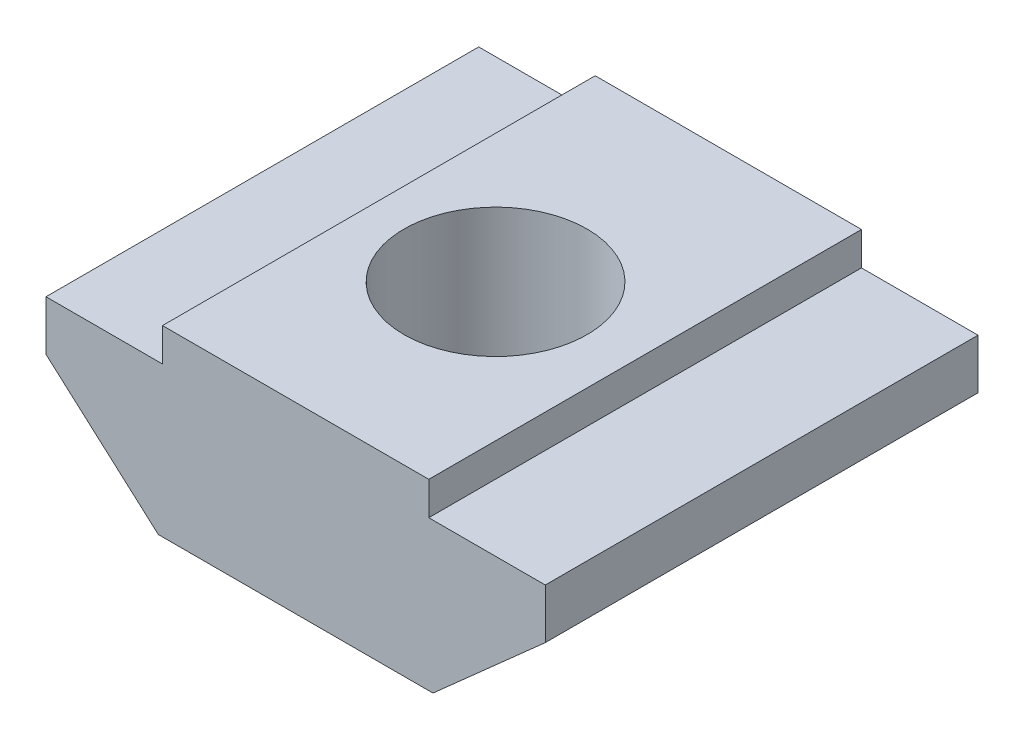
ISO-10303-21;
HEADER;
FILE_DESCRIPTION(('STEP AP214'),'2;1');
FILE_NAME('part.step','',(''),(''),'','','');
FILE_SCHEMA(('AUTOMOTIVE_DESIGN { 1 0 10303 214 1 1 1 1 }'));
ENDSEC;
DATA;
#1=APPLICATION_CONTEXT('core data for automotive mechanical design processes');
#2=APPLICATION_PROTOCOL_DEFINITION('international standard','automotive_design',2000,#1);
#3=PRODUCT_CONTEXT('',#1,'mechanical');
#4=PRODUCT('Part','Part','',(#3));
#5=PRODUCT_RELATED_PRODUCT_CATEGORY('part','',(#4));
#6=PRODUCT_DEFINITION_FORMATION('','',#4);
#7=PRODUCT_DEFINITION_CONTEXT('part definition',#1,'design');
#8=PRODUCT_DEFINITION('design','',#6,#7);
#9=PRODUCT_DEFINITION_SHAPE('','',#8);
#10=(LENGTH_UNIT() NAMED_UNIT(*) SI_UNIT(.MILLI.,.METRE.));
#11=(NAMED_UNIT(*) PLANE_ANGLE_UNIT() SI_UNIT($,.RADIAN.));
#12=(NAMED_UNIT(*) SI_UNIT($,.STERADIAN.) SOLID_ANGLE_UNIT());
#13=UNCERTAINTY_MEASURE_WITH_UNIT(LENGTH_MEASURE(1.E-05),#10,'distance_accuracy_value','');
#14=(GEOMETRIC_REPRESENTATION_CONTEXT(3) GLOBAL_UNCERTAINTY_ASSIGNED_CONTEXT((#13)) GLOBAL_UNIT_ASSIGNED_CONTEXT((#10,
#11,#12)) REPRESENTATION_CONTEXT('',''));
#15=CARTESIAN_POINT('',(0.,0.,0.));
#16=DIRECTION('',(0.,0.,1.));
#17=DIRECTION('',(1.,0.,0.));
#18=AXIS2_PLACEMENT_3D('',#15,#16,#17);
#19=CARTESIAN_POINT('',(-4.33688549496153,5.5,13.));
#20=DIRECTION('',(0.,-1.,0.));
#21=DIRECTION('',(0.,0.,-1.));
#22=AXIS2_PLACEMENT_3D('',#19,#20,#21);
#23=PLANE('',#22);
#24=DIRECTION('',(-1.,0.,0.));
#25=VECTOR('',#24,1.);
#26=CARTESIAN_POINT('',(-4.33688549496153,5.5,0.));
#27=LINE('',#26,#25);
#28=CARTESIAN_POINT('',(3.66311450503847,5.5,0.));
#29=VERTEX_POINT('',#28);
#30=CARTESIAN_POINT('',(-4.33688549496153,5.5,0.));
#31=VERTEX_POINT('',#30);
#32=EDGE_CURVE('E157',#29,#31,#27,.T.);
#33=ORIENTED_EDGE('',*,*,#32,.T.);
#34=DIRECTION('',(0.,0.,-1.));
#35=VECTOR('',#34,1.);
#36=CARTESIAN_POINT('',(-4.33688549496153,5.5,13.));
#37=LINE('',#36,#35);
#38=CARTESIAN_POINT('',(-4.33688549496153,5.5,13.));
#39=VERTEX_POINT('',#38);
#40=EDGE_CURVE('E134',#39,#31,#37,.T.);
#41=ORIENTED_EDGE('',*,*,#40,.F.);
#42=DIRECTION('',(-1.,0.,0.));
#43=VECTOR('',#42,1.);
#44=CARTESIAN_POINT('',(-4.33688549496153,5.5,13.));
#45=LINE('',#44,#43);
#46=CARTESIAN_POINT('',(3.66311450503847,5.5,13.));
#47=VERTEX_POINT('',#46);
#48=EDGE_CURVE('E125',#47,#39,#45,.T.);
#49=ORIENTED_EDGE('',*,*,#48,.F.);
#50=DIRECTION('',(0.,0.,-1.));
#51=VECTOR('',#50,1.);
#52=CARTESIAN_POINT('',(3.66311450503847,5.5,13.));
#53=LINE('',#52,#51);
#54=EDGE_CURVE('E166',#47,#29,#53,.T.);
#55=ORIENTED_EDGE('',*,*,#54,.T.);
#56=EDGE_LOOP('',(#33,#41,#49,#55));
#57=FACE_BOUND('',#56,.T.);
#58=CARTESIAN_POINT('',(-0.471799647864915,5.5,6.85919347099833));
#59=DIRECTION('',(0.,1.,0.));
#60=DIRECTION('',(0.,0.,1.));
#61=AXIS2_PLACEMENT_3D('',#58,#59,#60);
#62=CIRCLE('',#61,2.75);
#63=CARTESIAN_POINT('',(-0.471799647864915,5.5,9.60919347099833));
#64=VERTEX_POINT('',#63);
#65=EDGE_CURVE('E211',#64,#64,#62,.T.);
#66=ORIENTED_EDGE('',*,*,#65,.F.);
#67=EDGE_LOOP('',(#66));
#68=FACE_BOUND('',#67,.T.);
#69=ADVANCED_FACE('F34',(#57,#68),#23,.F.);
#70=CARTESIAN_POINT('',(-4.46188549496153,0.,13.));
#71=DIRECTION('',(0.66436383882992,0.74740931868366,0.));
#72=DIRECTION('',(-0.74740931868366,0.66436383882992,0.));
#73=AXIS2_PLACEMENT_3D('',#70,#71,#72);
#74=PLANE('',#73);
#75=DIRECTION('',(0.74740931868366,-0.66436383882992,0.));
#76=VECTOR('',#75,1.);
#77=CARTESIAN_POINT('',(-4.46188549496153,0.,0.));
#78=LINE('',#77,#76);
#79=CARTESIAN_POINT('',(-7.83688549496153,3.,0.));
#80=VERTEX_POINT('',#79);
#81=CARTESIAN_POINT('',(-4.46188549496153,0.,0.));
#82=VERTEX_POINT('',#81);
#83=EDGE_CURVE('E143',#80,#82,#78,.T.);
#84=ORIENTED_EDGE('',*,*,#83,.T.);
#85=DIRECTION('',(0.,0.,-1.));
#86=VECTOR('',#85,1.);
#87=CARTESIAN_POINT('',(-4.46188549496153,0.,13.));
#88=LINE('',#87,#86);
#89=CARTESIAN_POINT('',(-4.46188549496153,0.,13.));
#90=VERTEX_POINT('',#89);
#91=EDGE_CURVE('E11',#90,#82,#88,.T.);
#92=ORIENTED_EDGE('',*,*,#91,.F.);
#93=DIRECTION('',(0.74740931868366,-0.66436383882992,0.));
#94=VECTOR('',#93,1.);
#95=CARTESIAN_POINT('',(-4.46188549496153,0.,13.));
#96=LINE('',#95,#94);
#97=CARTESIAN_POINT('',(-7.83688549496153,3.,13.));
#98=VERTEX_POINT('',#97);
#99=EDGE_CURVE('E162',#98,#90,#96,.T.);
#100=ORIENTED_EDGE('',*,*,#99,.F.);
#101=DIRECTION('',(0.,0.,-1.));
#102=VECTOR('',#101,1.);
#103=CARTESIAN_POINT('',(-7.83688549496153,3.,13.));
#104=LINE('',#103,#102);
#105=EDGE_CURVE('E139',#98,#80,#104,.T.);
#106=ORIENTED_EDGE('',*,*,#105,.T.);
#107=EDGE_LOOP('',(#84,#92,#100,#106));
#108=FACE_BOUND('',#107,.T.);
#109=ADVANCED_FACE('F36',(#108),#74,.F.);
#110=CARTESIAN_POINT('',(-4.46188549496153,0.,13.));
#111=DIRECTION('',(0.,1.,0.));
#112=DIRECTION('',(0.,0.,1.));
#113=AXIS2_PLACEMENT_3D('',#110,#111,#112);
#114=PLANE('',#113);
#115=CARTESIAN_POINT('',(-0.471799647864915,0.,6.85919347099833));
#116=DIRECTION('',(0.,1.,0.));
#117=DIRECTION('',(0.,0.,1.));
#118=AXIS2_PLACEMENT_3D('',#115,#116,#117);
#119=CIRCLE('',#118,2.75);
#120=CARTESIAN_POINT('',(-0.471799647864915,0.,9.60919347099833));
#121=VERTEX_POINT('',#120);
#122=EDGE_CURVE('E147',#121,#121,#119,.T.);
#123=ORIENTED_EDGE('',*,*,#122,.T.);
#124=EDGE_LOOP('',(#123));
#125=FACE_BOUND('',#124,.T.);
#126=DIRECTION('',(1.,0.,0.));
#127=VECTOR('',#126,1.);
#128=CARTESIAN_POINT('',(-4.46188549496153,0.,0.));
#129=LINE('',#128,#127);
#130=CARTESIAN_POINT('',(3.78811450503847,0.,0.));
#131=VERTEX_POINT('',#130);
#132=EDGE_CURVE('E146',#82,#131,#129,.T.);
#133=ORIENTED_EDGE('',*,*,#132,.T.);
#134=DIRECTION('',(0.,0.,-1.));
#135=VECTOR('',#134,1.);
#136=CARTESIAN_POINT('',(3.78811450503847,0.,13.));
#137=LINE('',#136,#135);
#138=CARTESIAN_POINT('',(3.78811450503847,0.,13.));
#139=VERTEX_POINT('',#138);
#140=EDGE_CURVE('E43',#139,#131,#137,.T.);
#141=ORIENTED_EDGE('',*,*,#140,.F.);
#142=DIRECTION('',(1.,0.,0.));
#143=VECTOR('',#142,1.);
#144=CARTESIAN_POINT('',(-4.46188549496153,0.,13.));
#145=LINE('',#144,#143);
#146=EDGE_CURVE('E100',#90,#139,#145,.T.);
#147=ORIENTED_EDGE('',*,*,#146,.F.);
#148=ORIENTED_EDGE('',*,*,#91,.T.);
#149=EDGE_LOOP('',(#133,#141,#147,#148));
#150=FACE_BOUND('',#149,.T.);
#151=ADVANCED_FACE('F223',(#125,#150),#114,.F.);
#152=CARTESIAN_POINT('',(3.78811450503847,0.,13.));
#153=DIRECTION('',(-0.66436383882992,0.74740931868366,0.));
#154=DIRECTION('',(-0.74740931868366,-0.66436383882992,0.));
#155=AXIS2_PLACEMENT_3D('',#152,#153,#154);
#156=PLANE('',#155);
#157=DIRECTION('',(0.74740931868366,0.664363838829919,0.));
#158=VECTOR('',#157,1.);
#159=CARTESIAN_POINT('',(3.78811450503847,0.,0.));
#160=LINE('',#159,#158);
#161=CARTESIAN_POINT('',(7.16311450503847,3.,0.));
#162=VERTEX_POINT('',#161);
#163=EDGE_CURVE('E149',#131,#162,#160,.T.);
#164=ORIENTED_EDGE('',*,*,#163,.T.);
#165=DIRECTION('',(0.,0.,-1.));
#166=VECTOR('',#165,1.);
#167=CARTESIAN_POINT('',(7.16311450503847,3.,13.));
#168=LINE('',#167,#166);
#169=CARTESIAN_POINT('',(7.16311450503847,3.,13.));
#170=VERTEX_POINT('',#169);
#171=EDGE_CURVE('E175',#170,#162,#168,.T.);
#172=ORIENTED_EDGE('',*,*,#171,.F.);
#173=DIRECTION('',(0.74740931868366,0.664363838829919,0.));
#174=VECTOR('',#173,1.);
#175=CARTESIAN_POINT('',(3.78811450503847,0.,13.));
#176=LINE('',#175,#174);
#177=EDGE_CURVE('E183',#139,#170,#176,.T.);
#178=ORIENTED_EDGE('',*,*,#177,.F.);
#179=ORIENTED_EDGE('',*,*,#140,.T.);
#180=EDGE_LOOP('',(#164,#172,#178,#179));
#181=FACE_BOUND('',#180,.T.);
#182=ADVANCED_FACE('F181',(#181),#156,.F.);
#183=CARTESIAN_POINT('',(7.16311450503847,4.5,13.));
#184=DIRECTION('',(-1.,0.,0.));
#185=DIRECTION('',(0.,-1.,0.));
#186=AXIS2_PLACEMENT_3D('',#183,#184,#185);
#187=PLANE('',#186);
#188=DIRECTION('',(0.,1.,0.));
#189=VECTOR('',#188,1.);
#190=CARTESIAN_POINT('',(7.16311450503847,4.5,0.));
#191=LINE('',#190,#189);
#192=CARTESIAN_POINT('',(7.16311450503847,4.5,0.));
#193=VERTEX_POINT('',#192);
#194=EDGE_CURVE('E151',#162,#193,#191,.T.);
#195=ORIENTED_EDGE('',*,*,#194,.T.);
#196=DIRECTION('',(0.,0.,-1.));
#197=VECTOR('',#196,1.);
#198=CARTESIAN_POINT('',(7.16311450503847,4.5,13.));
#199=LINE('',#198,#197);
#200=CARTESIAN_POINT('',(7.16311450503847,4.5,13.));
#201=VERTEX_POINT('',#200);
#202=EDGE_CURVE('E172',#201,#193,#199,.T.);
#203=ORIENTED_EDGE('',*,*,#202,.F.);
#204=DIRECTION('',(0.,1.,0.));
#205=VECTOR('',#204,1.);
#206=CARTESIAN_POINT('',(7.16311450503847,4.5,13.));
#207=LINE('',#206,#205);
#208=EDGE_CURVE('E201',#170,#201,#207,.T.);
#209=ORIENTED_EDGE('',*,*,#208,.F.);
#210=ORIENTED_EDGE('',*,*,#171,.T.);
#211=EDGE_LOOP('',(#195,#203,#209,#210));
#212=FACE_BOUND('',#211,.T.);
#213=ADVANCED_FACE('F192',(#212),#187,.F.);
#214=CARTESIAN_POINT('',(3.66311450503847,4.5,13.));
#215=DIRECTION('',(0.,-1.,0.));
#216=DIRECTION('',(0.,0.,-1.));
#217=AXIS2_PLACEMENT_3D('',#214,#215,#216);
#218=PLANE('',#217);
#219=DIRECTION('',(-1.,0.,0.));
#220=VECTOR('',#219,1.);
#221=CARTESIAN_POINT('',(3.66311450503847,4.5,0.));
#222=LINE('',#221,#220);
#223=CARTESIAN_POINT('',(3.66311450503847,4.5,0.));
#224=VERTEX_POINT('',#223);
#225=EDGE_CURVE('E153',#193,#224,#222,.T.);
#226=ORIENTED_EDGE('',*,*,#225,.T.);
#227=DIRECTION('',(0.,0.,-1.));
#228=VECTOR('',#227,1.);
#229=CARTESIAN_POINT('',(3.66311450503847,4.5,13.));
#230=LINE('',#229,#228);
#231=CARTESIAN_POINT('',(3.66311450503847,4.5,13.));
#232=VERTEX_POINT('',#231);
#233=EDGE_CURVE('E169',#232,#224,#230,.T.);
#234=ORIENTED_EDGE('',*,*,#233,.F.);
#235=DIRECTION('',(-1.,0.,0.));
#236=VECTOR('',#235,1.);
#237=CARTESIAN_POINT('',(3.66311450503847,4.5,13.));
#238=LINE('',#237,#236);
#239=EDGE_CURVE('E198',#201,#232,#238,.T.);
#240=ORIENTED_EDGE('',*,*,#239,.F.);
#241=ORIENTED_EDGE('',*,*,#202,.T.);
#242=EDGE_LOOP('',(#226,#234,#240,#241));
#243=FACE_BOUND('',#242,.T.);
#244=ADVANCED_FACE('F196',(#243),#218,.F.);
#245=CARTESIAN_POINT('',(3.66311450503847,5.5,13.));
#246=DIRECTION('',(-1.,0.,0.));
#247=DIRECTION('',(0.,-1.,0.));
#248=AXIS2_PLACEMENT_3D('',#245,#246,#247);
#249=PLANE('',#248);
#250=DIRECTION('',(0.,1.,0.));
#251=VECTOR('',#250,1.);
#252=CARTESIAN_POINT('',(3.66311450503847,5.5,0.));
#253=LINE('',#252,#251);
#254=EDGE_CURVE('E155',#224,#29,#253,.T.);
#255=ORIENTED_EDGE('',*,*,#254,.T.);
#256=ORIENTED_EDGE('',*,*,#54,.F.);
#257=DIRECTION('',(0.,1.,0.));
#258=VECTOR('',#257,1.);
#259=CARTESIAN_POINT('',(3.66311450503847,5.5,13.));
#260=LINE('',#259,#258);
#261=EDGE_CURVE('E200',#232,#47,#260,.T.);
#262=ORIENTED_EDGE('',*,*,#261,.F.);
#263=ORIENTED_EDGE('',*,*,#233,.T.);
#264=EDGE_LOOP('',(#255,#256,#262,#263));
#265=FACE_BOUND('',#264,.T.);
#266=ADVANCED_FACE('F228',(#265),#249,.F.);
#267=CARTESIAN_POINT('',(-4.33688549496153,4.5,13.));
#268=DIRECTION('',(1.,0.,0.));
#269=DIRECTION('',(0.,0.,-1.));
#270=AXIS2_PLACEMENT_3D('',#267,#268,#269);
#271=PLANE('',#270);
#272=DIRECTION('',(0.,-1.,0.));
#273=VECTOR('',#272,1.);
#274=CARTESIAN_POINT('',(-4.33688549496153,4.5,0.));
#275=LINE('',#274,#273);
#276=CARTESIAN_POINT('',(-4.33688549496153,4.5,0.));
#277=VERTEX_POINT('',#276);
#278=EDGE_CURVE('E133',#31,#277,#275,.T.);
#279=ORIENTED_EDGE('',*,*,#278,.T.);
#280=DIRECTION('',(0.,0.,-1.));
#281=VECTOR('',#280,1.);
#282=CARTESIAN_POINT('',(-4.33688549496153,4.5,13.));
#283=LINE('',#282,#281);
#284=CARTESIAN_POINT('',(-4.33688549496153,4.5,13.));
#285=VERTEX_POINT('',#284);
#286=EDGE_CURVE('E130',#285,#277,#283,.T.);
#287=ORIENTED_EDGE('',*,*,#286,.F.);
#288=DIRECTION('',(0.,-1.,0.));
#289=VECTOR('',#288,1.);
#290=CARTESIAN_POINT('',(-4.33688549496153,4.5,13.));
#291=LINE('',#290,#289);
#292=EDGE_CURVE('E119',#39,#285,#291,.T.);
#293=ORIENTED_EDGE('',*,*,#292,.F.);
#294=ORIENTED_EDGE('',*,*,#40,.T.);
#295=EDGE_LOOP('',(#279,#287,#293,#294));
#296=FACE_BOUND('',#295,.T.);
#297=ADVANCED_FACE('F131',(#296),#271,.F.);
#298=CARTESIAN_POINT('',(-7.83688549496153,4.5,13.));
#299=DIRECTION('',(0.,-1.,0.));
#300=DIRECTION('',(0.,0.,-1.));
#301=AXIS2_PLACEMENT_3D('',#298,#299,#300);
#302=PLANE('',#301);
#303=DIRECTION('',(-1.,0.,0.));
#304=VECTOR('',#303,1.);
#305=CARTESIAN_POINT('',(-7.83688549496153,4.5,0.));
#306=LINE('',#305,#304);
#307=CARTESIAN_POINT('',(-7.83688549496153,4.5,0.));
#308=VERTEX_POINT('',#307);
#309=EDGE_CURVE('E86',#277,#308,#306,.T.);
#310=ORIENTED_EDGE('',*,*,#309,.T.);
#311=DIRECTION('',(0.,0.,-1.));
#312=VECTOR('',#311,1.);
#313=CARTESIAN_POINT('',(-7.83688549496153,4.5,13.));
#314=LINE('',#313,#312);
#315=CARTESIAN_POINT('',(-7.83688549496153,4.5,13.));
#316=VERTEX_POINT('',#315);
#317=EDGE_CURVE('E135',#316,#308,#314,.T.);
#318=ORIENTED_EDGE('',*,*,#317,.F.);
#319=DIRECTION('',(-1.,0.,0.));
#320=VECTOR('',#319,1.);
#321=CARTESIAN_POINT('',(-7.83688549496153,4.5,13.));
#322=LINE('',#321,#320);
#323=EDGE_CURVE('E123',#285,#316,#322,.T.);
#324=ORIENTED_EDGE('',*,*,#323,.F.);
#325=ORIENTED_EDGE('',*,*,#286,.T.);
#326=EDGE_LOOP('',(#310,#318,#324,#325));
#327=FACE_BOUND('',#326,.T.);
#328=ADVANCED_FACE('F137',(#327),#302,.F.);
#329=CARTESIAN_POINT('',(-7.83688549496153,3.,13.));
#330=DIRECTION('',(1.,0.,0.));
#331=DIRECTION('',(0.,0.,-1.));
#332=AXIS2_PLACEMENT_3D('',#329,#330,#331);
#333=PLANE('',#332);
#334=DIRECTION('',(0.,-1.,0.));
#335=VECTOR('',#334,1.);
#336=CARTESIAN_POINT('',(-7.83688549496153,3.,0.));
#337=LINE('',#336,#335);
#338=EDGE_CURVE('E92',#308,#80,#337,.T.);
#339=ORIENTED_EDGE('',*,*,#338,.T.);
#340=ORIENTED_EDGE('',*,*,#105,.F.);
#341=DIRECTION('',(0.,-1.,0.));
#342=VECTOR('',#341,1.);
#343=CARTESIAN_POINT('',(-7.83688549496153,3.,13.));
#344=LINE('',#343,#342);
#345=EDGE_CURVE('E51',#316,#98,#344,.T.);
#346=ORIENTED_EDGE('',*,*,#345,.F.);
#347=ORIENTED_EDGE('',*,*,#317,.T.);
#348=EDGE_LOOP('',(#339,#340,#346,#347));
#349=FACE_BOUND('',#348,.T.);
#350=ADVANCED_FACE('F246',(#349),#333,.F.);
#351=CARTESIAN_POINT('',(0.,0.,13.));
#352=DIRECTION('',(0.,0.,-1.));
#353=DIRECTION('',(-1.,0.,0.));
#354=AXIS2_PLACEMENT_3D('',#351,#352,#353);
#355=PLANE('',#354);
#356=ORIENTED_EDGE('',*,*,#99,.T.);
#357=ORIENTED_EDGE('',*,*,#146,.T.);
#358=ORIENTED_EDGE('',*,*,#177,.T.);
#359=ORIENTED_EDGE('',*,*,#208,.T.);
#360=ORIENTED_EDGE('',*,*,#239,.T.);
#361=ORIENTED_EDGE('',*,*,#261,.T.);
#362=ORIENTED_EDGE('',*,*,#48,.T.);
#363=ORIENTED_EDGE('',*,*,#292,.T.);
#364=ORIENTED_EDGE('',*,*,#323,.T.);
#365=ORIENTED_EDGE('',*,*,#345,.T.);
#366=EDGE_LOOP('',(#356,#357,#358,#359,#360,#361,#362,#363,#364,#365));
#367=FACE_BOUND('',#366,.T.);
#368=ADVANCED_FACE('F121',(#367),#355,.F.);
#369=CARTESIAN_POINT('',(0.,0.,0.));
#370=DIRECTION('',(0.,0.,-1.));
#371=DIRECTION('',(-1.,0.,0.));
#372=AXIS2_PLACEMENT_3D('',#369,#370,#371);
#373=PLANE('',#372);
#374=ORIENTED_EDGE('',*,*,#83,.F.);
#375=ORIENTED_EDGE('',*,*,#338,.F.);
#376=ORIENTED_EDGE('',*,*,#309,.F.);
#377=ORIENTED_EDGE('',*,*,#278,.F.);
#378=ORIENTED_EDGE('',*,*,#32,.F.);
#379=ORIENTED_EDGE('',*,*,#254,.F.);
#380=ORIENTED_EDGE('',*,*,#225,.F.);
#381=ORIENTED_EDGE('',*,*,#194,.F.);
#382=ORIENTED_EDGE('',*,*,#163,.F.);
#383=ORIENTED_EDGE('',*,*,#132,.F.);
#384=EDGE_LOOP('',(#374,#375,#376,#377,#378,#379,#380,#381,#382,#383));
#385=FACE_BOUND('',#384,.T.);
#386=ADVANCED_FACE('F187',(#385),#373,.T.);
#387=CARTESIAN_POINT('',(-0.471799647864915,5.5,6.85919347099833));
#388=DIRECTION('',(0.,1.,0.));
#389=DIRECTION('',(0.,0.,1.));
#390=AXIS2_PLACEMENT_3D('',#387,#388,#389);
#391=CYLINDRICAL_SURFACE('',#390,2.75);
#392=ORIENTED_EDGE('',*,*,#122,.F.);
#393=EDGE_LOOP('',(#392));
#394=FACE_BOUND('',#393,.T.);
#395=ORIENTED_EDGE('',*,*,#65,.T.);
#396=EDGE_LOOP('',(#395));
#397=FACE_BOUND('',#396,.T.);
#398=ADVANCED_FACE('F215',(#394,#397),#391,.F.);
#399=CLOSED_SHELL('',(#69,#109,#151,#182,#213,#244,#266,#297,#328,#350,#368,#386,#398));
#400=MANIFOLD_SOLID_BREP('B2',#399);
#401=ADVANCED_BREP_SHAPE_REPRESENTATION('',(#18,#400),#14);
#402=SHAPE_DEFINITION_REPRESENTATION(#9,#401);
ENDSEC;
END-ISO-10303-21;
